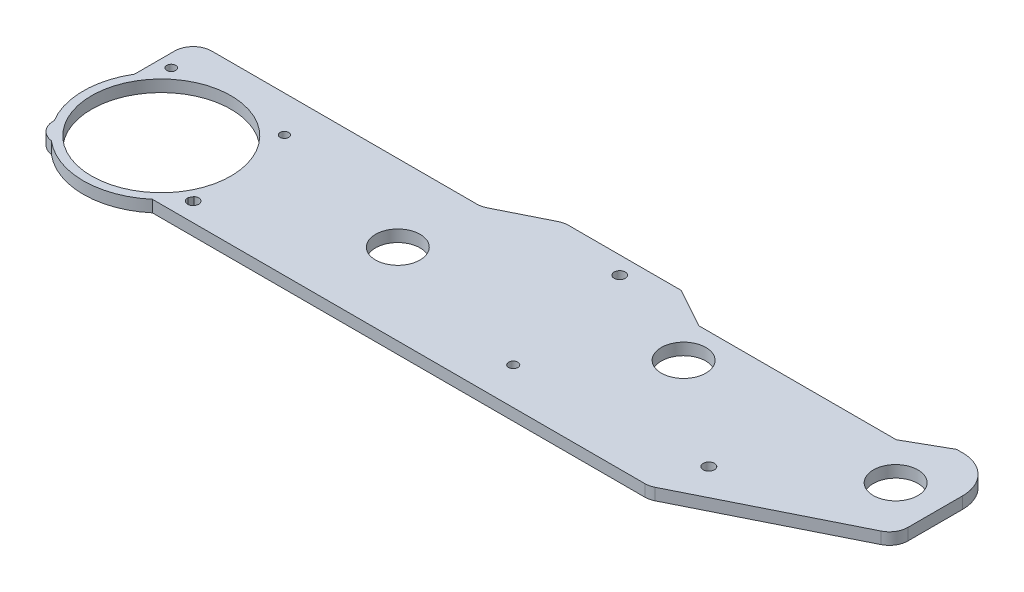
ISO-10303-21;
HEADER;
FILE_DESCRIPTION(('STEP AP214'),'2;1');
FILE_NAME('part.step','',(''),(''),'','','');
FILE_SCHEMA(('AUTOMOTIVE_DESIGN { 1 0 10303 214 1 1 1 1 }'));
ENDSEC;
DATA;
#1=APPLICATION_CONTEXT('core data for automotive mechanical design processes');
#2=APPLICATION_PROTOCOL_DEFINITION('international standard','automotive_design',2000,#1);
#3=PRODUCT_CONTEXT('',#1,'mechanical');
#4=PRODUCT('Part','Part','',(#3));
#5=PRODUCT_RELATED_PRODUCT_CATEGORY('part','',(#4));
#6=PRODUCT_DEFINITION_FORMATION('','',#4);
#7=PRODUCT_DEFINITION_CONTEXT('part definition',#1,'design');
#8=PRODUCT_DEFINITION('design','',#6,#7);
#9=PRODUCT_DEFINITION_SHAPE('','',#8);
#10=(LENGTH_UNIT() NAMED_UNIT(*) SI_UNIT(.MILLI.,.METRE.));
#11=(NAMED_UNIT(*) PLANE_ANGLE_UNIT() SI_UNIT($,.RADIAN.));
#12=(NAMED_UNIT(*) SI_UNIT($,.STERADIAN.) SOLID_ANGLE_UNIT());
#13=UNCERTAINTY_MEASURE_WITH_UNIT(LENGTH_MEASURE(1.E-05),#10,'distance_accuracy_value','');
#14=(GEOMETRIC_REPRESENTATION_CONTEXT(3) GLOBAL_UNCERTAINTY_ASSIGNED_CONTEXT((#13)) GLOBAL_UNIT_ASSIGNED_CONTEXT((#10,
#11,#12)) REPRESENTATION_CONTEXT('',''));
#15=CARTESIAN_POINT('',(0.,0.,0.));
#16=DIRECTION('',(0.,0.,1.));
#17=DIRECTION('',(1.,0.,0.));
#18=AXIS2_PLACEMENT_3D('',#15,#16,#17);
#19=CARTESIAN_POINT('',(0.,3.175,0.));
#20=DIRECTION('',(1.,0.,0.));
#21=DIRECTION('',(0.,0.,-1.));
#22=AXIS2_PLACEMENT_3D('',#19,#20,#21);
#23=PLANE('',#22);
#24=DIRECTION('',(0.,0.,1.));
#25=VECTOR('',#24,1.);
#26=CARTESIAN_POINT('',(0.,0.,0.));
#27=LINE('',#26,#25);
#28=CARTESIAN_POINT('',(0.,0.,12.4028120633884));
#29=VERTEX_POINT('',#28);
#30=CARTESIAN_POINT('',(0.,0.,23.1833461736081));
#31=VERTEX_POINT('',#30);
#32=EDGE_CURVE('E231',#29,#31,#27,.T.);
#33=ORIENTED_EDGE('',*,*,#32,.T.);
#34=DIRECTION('',(0.,1.,0.));
#35=VECTOR('',#34,1.);
#36=CARTESIAN_POINT('',(0.,0.,23.1833461736081));
#37=LINE('',#36,#35);
#38=CARTESIAN_POINT('',(0.,3.175,23.1833461736081));
#39=VERTEX_POINT('',#38);
#40=EDGE_CURVE('E438',#31,#39,#37,.T.);
#41=ORIENTED_EDGE('',*,*,#40,.T.);
#42=DIRECTION('',(0.,0.,1.));
#43=VECTOR('',#42,1.);
#44=CARTESIAN_POINT('',(0.,3.175,0.));
#45=LINE('',#44,#43);
#46=CARTESIAN_POINT('',(0.,3.175,12.4028120633884));
#47=VERTEX_POINT('',#46);
#48=EDGE_CURVE('E219',#47,#39,#45,.T.);
#49=ORIENTED_EDGE('',*,*,#48,.F.);
#50=DIRECTION('',(0.,1.,0.));
#51=VECTOR('',#50,1.);
#52=CARTESIAN_POINT('',(0.,3.175,12.4028120633884));
#53=LINE('',#52,#51);
#54=EDGE_CURVE('E274',#47,#29,#53,.F.);
#55=ORIENTED_EDGE('',*,*,#54,.T.);
#56=EDGE_LOOP('',(#33,#41,#49,#55));
#57=FACE_BOUND('',#56,.T.);
#58=ADVANCED_FACE('F35',(#57),#23,.F.);
#59=CARTESIAN_POINT('',(0.,3.175,0.));
#60=DIRECTION('',(0.,0.,1.));
#61=DIRECTION('',(1.,0.,0.));
#62=AXIS2_PLACEMENT_3D('',#59,#60,#61);
#63=PLANE('',#62);
#64=DIRECTION('',(-1.,0.,0.));
#65=VECTOR('',#64,1.);
#66=CARTESIAN_POINT('',(0.,3.175,0.));
#67=LINE('',#66,#65);
#68=CARTESIAN_POINT('',(200.,3.175,0.));
#69=VERTEX_POINT('',#68);
#70=CARTESIAN_POINT('',(198.343585303367,3.175,0.));
#71=VERTEX_POINT('',#70);
#72=EDGE_CURVE('E228',#69,#71,#67,.T.);
#73=ORIENTED_EDGE('',*,*,#72,.F.);
#74=DIRECTION('',(0.,-1.,0.));
#75=VECTOR('',#74,1.);
#76=CARTESIAN_POINT('',(200.,3.175,0.));
#77=LINE('',#76,#75);
#78=CARTESIAN_POINT('',(200.,0.,0.));
#79=VERTEX_POINT('',#78);
#80=EDGE_CURVE('E314',#69,#79,#77,.T.);
#81=ORIENTED_EDGE('',*,*,#80,.T.);
#82=DIRECTION('',(-1.,0.,0.));
#83=VECTOR('',#82,1.);
#84=CARTESIAN_POINT('',(0.,0.,0.));
#85=LINE('',#84,#83);
#86=CARTESIAN_POINT('',(198.343585303367,0.,0.));
#87=VERTEX_POINT('',#86);
#88=EDGE_CURVE('E240',#79,#87,#85,.T.);
#89=ORIENTED_EDGE('',*,*,#88,.T.);
#90=DIRECTION('',(0.,1.,0.));
#91=VECTOR('',#90,1.);
#92=CARTESIAN_POINT('',(198.343585303367,3.175,0.));
#93=LINE('',#92,#91);
#94=EDGE_CURVE('E255',#87,#71,#93,.T.);
#95=ORIENTED_EDGE('',*,*,#94,.T.);
#96=EDGE_LOOP('',(#73,#81,#89,#95));
#97=FACE_BOUND('',#96,.T.);
#98=ADVANCED_FACE('F323',(#97),#63,.F.);
#99=CARTESIAN_POINT('',(0.,3.175,0.));
#100=DIRECTION('',(0.,1.,0.));
#101=DIRECTION('',(0.,0.,1.));
#102=AXIS2_PLACEMENT_3D('',#99,#100,#101);
#103=PLANE('',#102);
#104=CARTESIAN_POINT('',(18.,3.175,34.));
#105=DIRECTION('',(0.,1.,0.));
#106=DIRECTION('',(0.,0.,1.));
#107=AXIS2_PLACEMENT_3D('',#104,#105,#106);
#108=CIRCLE('',#107,18.78);
#109=CARTESIAN_POINT('',(18.,3.175,52.78));
#110=VERTEX_POINT('',#109);
#111=EDGE_CURVE('E317',#110,#110,#108,.T.);
#112=ORIENTED_EDGE('',*,*,#111,.F.);
#113=EDGE_LOOP('',(#112));
#114=FACE_BOUND('',#113,.T.);
#115=CARTESIAN_POINT('',(37.5207499584055,3.175,44.9211981208464));
#116=DIRECTION('',(0.,1.,0.));
#117=DIRECTION('',(0.,0.,1.));
#118=AXIS2_PLACEMENT_3D('',#115,#116,#117);
#119=CIRCLE('',#118,1.5);
#120=CARTESIAN_POINT('',(36.028479152304,3.175,44.7691197158792));
#121=VERTEX_POINT('',#120);
#122=CARTESIAN_POINT('',(36.6103540196022,3.175,43.7290658988968));
#123=VERTEX_POINT('',#122);
#124=EDGE_CURVE('E375',#121,#123,#119,.T.);
#125=ORIENTED_EDGE('',*,*,#124,.F.);
#126=CARTESIAN_POINT('',(18.,3.175,34.));
#127=DIRECTION('',(0.,1.,0.));
#128=DIRECTION('',(0.,0.,1.));
#129=AXIS2_PLACEMENT_3D('',#126,#127,#128);
#130=CIRCLE('',#129,21.);
#131=EDGE_CURVE('E213',#121,#123,#130,.T.);
#132=ORIENTED_EDGE('',*,*,#131,.T.);
#133=EDGE_LOOP('',(#125,#132));
#134=FACE_BOUND('',#133,.T.);
#135=DIRECTION('',(0.,0.,-1.));
#136=VECTOR('',#135,1.);
#137=CARTESIAN_POINT('',(210.,3.175,0.));
#138=LINE('',#137,#136);
#139=CARTESIAN_POINT('',(210.,3.175,24.7625472044585));
#140=VERTEX_POINT('',#139);
#141=CARTESIAN_POINT('',(210.,3.175,10.));
#142=VERTEX_POINT('',#141);
#143=EDGE_CURVE('E218',#140,#142,#138,.T.);
#144=ORIENTED_EDGE('',*,*,#143,.T.);
#145=CARTESIAN_POINT('',(200.,3.175,10.));
#146=DIRECTION('',(0.,1.,0.));
#147=DIRECTION('',(0.,0.,1.));
#148=AXIS2_PLACEMENT_3D('',#145,#146,#147);
#149=CIRCLE('',#148,10.);
#150=EDGE_CURVE('E11',#142,#69,#149,.T.);
#151=ORIENTED_EDGE('',*,*,#150,.T.);
#152=ORIENTED_EDGE('',*,*,#72,.T.);
#153=DIRECTION('',(0.869999014001896,0.,-0.493053461234914));
#154=VECTOR('',#153,1.);
#155=CARTESIAN_POINT('',(187.967697751047,3.175,5.8803138724528));
#156=LINE('',#155,#154);
#157=CARTESIAN_POINT('',(187.967697751047,3.175,5.8803138724528));
#158=VERTEX_POINT('',#157);
#159=EDGE_CURVE('E458',#158,#71,#156,.T.);
#160=ORIENTED_EDGE('',*,*,#159,.F.);
#161=DIRECTION('',(1.,0.,0.));
#162=VECTOR('',#161,1.);
#163=CARTESIAN_POINT('',(134.77031329487,3.175,5.8803138724528));
#164=LINE('',#163,#162);
#165=CARTESIAN_POINT('',(134.77031329487,3.175,5.8803138724528));
#166=VERTEX_POINT('',#165);
#167=EDGE_CURVE('E455',#166,#158,#164,.T.);
#168=ORIENTED_EDGE('',*,*,#167,.F.);
#169=DIRECTION('',(0.875621402801549,0.,0.482998094153432));
#170=VECTOR('',#169,1.);
#171=CARTESIAN_POINT('',(124.109963400663,3.175,0.));
#172=LINE('',#171,#170);
#173=CARTESIAN_POINT('',(124.109963400663,3.175,0.));
#174=VERTEX_POINT('',#173);
#175=EDGE_CURVE('E440',#174,#166,#172,.T.);
#176=ORIENTED_EDGE('',*,*,#175,.F.);
#177=CARTESIAN_POINT('',(93.707824868426,3.175,0.));
#178=VERTEX_POINT('',#177);
#179=EDGE_CURVE('E221',#174,#178,#67,.T.);
#180=ORIENTED_EDGE('',*,*,#179,.T.);
#181=CARTESIAN_POINT('',(93.707824868426,3.175,5.));
#182=DIRECTION('',(0.,1.,0.));
#183=DIRECTION('',(0.,0.,1.));
#184=AXIS2_PLACEMENT_3D('',#181,#182,#183);
#185=CIRCLE('',#184,5.);
#186=CARTESIAN_POINT('',(91.4804528275483,3.175,0.523526634557482));
#187=VERTEX_POINT('',#186);
#188=EDGE_CURVE('E283',#178,#187,#185,.T.);
#189=ORIENTED_EDGE('',*,*,#188,.T.);
#190=DIRECTION('',(0.895294673088504,0.,-0.445474408175541));
#191=VECTOR('',#190,1.);
#192=CARTESIAN_POINT('',(92.5326133973527,3.175,0.));
#193=LINE('',#192,#191);
#194=CARTESIAN_POINT('',(78.7069311896764,3.175,6.87928542883095));
#195=VERTEX_POINT('',#194);
#196=EDGE_CURVE('E446',#195,#187,#193,.T.);
#197=ORIENTED_EDGE('',*,*,#196,.F.);
#198=CARTESIAN_POINT('',(76.4795591487987,3.175,2.40281206338843));
#199=DIRECTION('',(0.,1.,0.));
#200=DIRECTION('',(0.,0.,1.));
#201=AXIS2_PLACEMENT_3D('',#198,#199,#200);
#202=CIRCLE('',#201,5.);
#203=CARTESIAN_POINT('',(76.4795591487987,3.175,7.40281206338843));
#204=VERTEX_POINT('',#203);
#205=EDGE_CURVE('E308',#195,#204,#202,.F.);
#206=ORIENTED_EDGE('',*,*,#205,.T.);
#207=DIRECTION('',(1.,0.,0.));
#208=VECTOR('',#207,1.);
#209=CARTESIAN_POINT('',(77.654770619872,3.175,7.40281206338843));
#210=LINE('',#209,#208);
#211=CARTESIAN_POINT('',(5.,3.175,7.40281206338842));
#212=VERTEX_POINT('',#211);
#213=EDGE_CURVE('E447',#212,#204,#210,.T.);
#214=ORIENTED_EDGE('',*,*,#213,.F.);
#215=CARTESIAN_POINT('',(5.,3.175,12.4028120633884));
#216=DIRECTION('',(0.,1.,0.));
#217=DIRECTION('',(0.,0.,1.));
#218=AXIS2_PLACEMENT_3D('',#215,#216,#217);
#219=CIRCLE('',#218,5.);
#220=EDGE_CURVE('E285',#212,#47,#219,.T.);
#221=ORIENTED_EDGE('',*,*,#220,.T.);
#222=ORIENTED_EDGE('',*,*,#48,.T.);
#223=CARTESIAN_POINT('',(0.,3.175,44.816653826392));
#224=VERTEX_POINT('',#223);
#225=EDGE_CURVE('E210',#39,#224,#130,.T.);
#226=ORIENTED_EDGE('',*,*,#225,.T.);
#227=CARTESIAN_POINT('',(0.,3.175,45.));
#228=VERTEX_POINT('',#227);
#229=EDGE_CURVE('E224',#224,#228,#45,.T.);
#230=ORIENTED_EDGE('',*,*,#229,.T.);
#231=CARTESIAN_POINT('',(5.00000000000001,3.175,45.));
#232=DIRECTION('',(0.,1.,0.));
#233=DIRECTION('',(0.,0.,1.));
#234=AXIS2_PLACEMENT_3D('',#231,#232,#233);
#235=CIRCLE('',#234,5.);
#236=CARTESIAN_POINT('',(4.34855225390096,3.175,49.9573799364284));
#237=VERTEX_POINT('',#236);
#238=EDGE_CURVE('E209',#228,#237,#235,.T.);
#239=ORIENTED_EDGE('',*,*,#238,.T.);
#240=CARTESIAN_POINT('',(31.6014705087354,3.175,50.));
#241=VERTEX_POINT('',#240);
#242=EDGE_CURVE('E192',#237,#241,#130,.T.);
#243=ORIENTED_EDGE('',*,*,#242,.T.);
#244=DIRECTION('',(1.,0.,0.));
#245=VECTOR('',#244,1.);
#246=CARTESIAN_POINT('',(0.,3.175,50.));
#247=LINE('',#246,#245);
#248=CARTESIAN_POINT('',(164.327666523127,3.175,50.));
#249=VERTEX_POINT('',#248);
#250=EDGE_CURVE('E206',#241,#249,#247,.T.);
#251=ORIENTED_EDGE('',*,*,#250,.T.);
#252=CARTESIAN_POINT('',(164.327666523127,3.175,45.));
#253=DIRECTION('',(0.,1.,0.));
#254=DIRECTION('',(0.,0.,1.));
#255=AXIS2_PLACEMENT_3D('',#252,#253,#254);
#256=CIRCLE('',#255,5.);
#257=CARTESIAN_POINT('',(166.555038564004,3.175,49.4764733654425));
#258=VERTEX_POINT('',#257);
#259=EDGE_CURVE('E279',#249,#258,#256,.T.);
#260=ORIENTED_EDGE('',*,*,#259,.T.);
#261=DIRECTION('',(-0.895294673088504,0.,0.445474408175541));
#262=VECTOR('',#261,1.);
#263=CARTESIAN_POINT('',(210.,3.175,27.8594359076578));
#264=LINE('',#263,#262);
#265=CARTESIAN_POINT('',(207.227372040878,3.175,29.2390205699011));
#266=VERTEX_POINT('',#265);
#267=EDGE_CURVE('E340',#266,#258,#264,.T.);
#268=ORIENTED_EDGE('',*,*,#267,.F.);
#269=CARTESIAN_POINT('',(205.,3.175,24.7625472044585));
#270=DIRECTION('',(0.,1.,0.));
#271=DIRECTION('',(0.,0.,1.));
#272=AXIS2_PLACEMENT_3D('',#269,#270,#271);
#273=CIRCLE('',#272,5.);
#274=EDGE_CURVE('E281',#266,#140,#273,.T.);
#275=ORIENTED_EDGE('',*,*,#274,.T.);
#276=EDGE_LOOP('',(#144,#151,#152,#160,#168,#176,#180,#189,#197,#206,#214,#221,#222,#226,#230,
#239,#243,#251,#260,#268,#275));
#277=FACE_BOUND('',#276,.T.);
#278=CARTESIAN_POINT('',(140.771956051245,3.175,16.));
#279=DIRECTION('',(0.,1.,0.));
#280=DIRECTION('',(0.,0.,1.));
#281=AXIS2_PLACEMENT_3D('',#278,#279,#280);
#282=CIRCLE('',#281,6.00000000000002);
#283=CARTESIAN_POINT('',(140.771956051245,3.175,22.));
#284=VERTEX_POINT('',#283);
#285=EDGE_CURVE('E349',#284,#284,#282,.T.);
#286=ORIENTED_EDGE('',*,*,#285,.F.);
#287=EDGE_LOOP('',(#286));
#288=FACE_BOUND('',#287,.T.);
#289=CARTESIAN_POINT('',(197.921956051245,3.175,16.));
#290=DIRECTION('',(0.,1.,0.));
#291=DIRECTION('',(0.,0.,1.));
#292=AXIS2_PLACEMENT_3D('',#289,#290,#291);
#293=CIRCLE('',#292,6.00000000000002);
#294=CARTESIAN_POINT('',(197.921956051245,3.175,22.));
#295=VERTEX_POINT('',#294);
#296=EDGE_CURVE('E350',#295,#295,#293,.T.);
#297=ORIENTED_EDGE('',*,*,#296,.F.);
#298=EDGE_LOOP('',(#297));
#299=FACE_BOUND('',#298,.T.);
#300=CARTESIAN_POINT('',(75.8499135695119,3.175,28.1));
#301=DIRECTION('',(0.,1.,0.));
#302=DIRECTION('',(0.,0.,1.));
#303=AXIS2_PLACEMENT_3D('',#300,#301,#302);
#304=CIRCLE('',#303,6.);
#305=CARTESIAN_POINT('',(75.8499135695119,3.175,34.1));
#306=VERTEX_POINT('',#305);
#307=EDGE_CURVE('E246',#306,#306,#304,.T.);
#308=ORIENTED_EDGE('',*,*,#307,.F.);
#309=EDGE_LOOP('',(#308));
#310=FACE_BOUND('',#309,.T.);
#311=CARTESIAN_POINT('',(112.302052498536,3.175,4.73926011491407));
#312=DIRECTION('',(0.,1.,0.));
#313=DIRECTION('',(0.,0.,1.));
#314=AXIS2_PLACEMENT_3D('',#311,#312,#313);
#315=CIRCLE('',#314,1.50000000000013);
#316=CARTESIAN_POINT('',(112.302052498536,3.175,6.2392601149142));
#317=VERTEX_POINT('',#316);
#318=EDGE_CURVE('E363',#317,#317,#315,.T.);
#319=ORIENTED_EDGE('',*,*,#318,.F.);
#320=EDGE_LOOP('',(#319));
#321=FACE_BOUND('',#320,.T.);
#322=CARTESIAN_POINT('',(3.48952623297482,3.175,16.7876611117285));
#323=DIRECTION('',(0.,1.,0.));
#324=DIRECTION('',(0.,0.,1.));
#325=AXIS2_PLACEMENT_3D('',#322,#323,#324);
#326=CIRCLE('',#325,1.21166501811253);
#327=CARTESIAN_POINT('',(3.48952623297482,3.175,17.999326129841));
#328=VERTEX_POINT('',#327);
#329=EDGE_CURVE('E386',#328,#328,#326,.T.);
#330=ORIENTED_EDGE('',*,*,#329,.F.);
#331=EDGE_LOOP('',(#330));
#332=FACE_BOUND('',#331,.T.);
#333=CARTESIAN_POINT('',(34.3725877204713,3.175,17.1940052448511));
#334=DIRECTION('',(0.,1.,0.));
#335=DIRECTION('',(0.,0.,1.));
#336=AXIS2_PLACEMENT_3D('',#333,#334,#335);
#337=CIRCLE('',#336,1.16561711842174);
#338=CARTESIAN_POINT('',(34.3725877204713,3.175,18.3596223632728));
#339=VERTEX_POINT('',#338);
#340=EDGE_CURVE('E380',#339,#339,#337,.T.);
#341=ORIENTED_EDGE('',*,*,#340,.F.);
#342=EDGE_LOOP('',(#341));
#343=FACE_BOUND('',#342,.T.);
#344=CARTESIAN_POINT('',(118.879039361021,3.175,40.0176850426405));
#345=DIRECTION('',(0.,1.,0.));
#346=DIRECTION('',(0.,0.,1.));
#347=AXIS2_PLACEMENT_3D('',#344,#345,#346);
#348=CIRCLE('',#347,1.25);
#349=CARTESIAN_POINT('',(118.879039361021,3.175,41.2676850426405));
#350=VERTEX_POINT('',#349);
#351=EDGE_CURVE('E369',#350,#350,#348,.T.);
#352=ORIENTED_EDGE('',*,*,#351,.F.);
#353=EDGE_LOOP('',(#352));
#354=FACE_BOUND('',#353,.T.);
#355=CARTESIAN_POINT('',(168.975233936324,3.175,37.4032096333009));
#356=DIRECTION('',(0.,1.,0.));
#357=DIRECTION('',(0.,0.,1.));
#358=AXIS2_PLACEMENT_3D('',#355,#356,#357);
#359=CIRCLE('',#358,1.51727390455077);
#360=CARTESIAN_POINT('',(168.975233936324,3.175,38.9204835378516));
#361=VERTEX_POINT('',#360);
#362=EDGE_CURVE('E357',#361,#361,#359,.T.);
#363=ORIENTED_EDGE('',*,*,#362,.F.);
#364=EDGE_LOOP('',(#363));
#365=FACE_BOUND('',#364,.T.);
#366=ADVANCED_FACE('F204',(#114,#134,#277,#288,#299,#310,#321,#332,#343,#354,#365),#103,.T.);
#367=CARTESIAN_POINT('',(0.,0.,0.));
#368=DIRECTION('',(0.,1.,0.));
#369=DIRECTION('',(0.,0.,1.));
#370=AXIS2_PLACEMENT_3D('',#367,#368,#369);
#371=PLANE('',#370);
#372=CARTESIAN_POINT('',(18.,0.,34.));
#373=DIRECTION('',(0.,1.,0.));
#374=DIRECTION('',(0.,0.,1.));
#375=AXIS2_PLACEMENT_3D('',#372,#373,#374);
#376=CIRCLE('',#375,18.78);
#377=CARTESIAN_POINT('',(18.,0.,52.78));
#378=VERTEX_POINT('',#377);
#379=EDGE_CURVE('E211',#378,#378,#376,.T.);
#380=ORIENTED_EDGE('',*,*,#379,.T.);
#381=EDGE_LOOP('',(#380));
#382=FACE_BOUND('',#381,.T.);
#383=CARTESIAN_POINT('',(18.,0.,34.));
#384=DIRECTION('',(0.,1.,0.));
#385=DIRECTION('',(0.,0.,1.));
#386=AXIS2_PLACEMENT_3D('',#383,#384,#385);
#387=CIRCLE('',#386,21.);
#388=CARTESIAN_POINT('',(36.028479152304,0.,44.7691197158792));
#389=VERTEX_POINT('',#388);
#390=CARTESIAN_POINT('',(36.6103540196022,0.,43.7290658988968));
#391=VERTEX_POINT('',#390);
#392=EDGE_CURVE('E523',#389,#391,#387,.T.);
#393=ORIENTED_EDGE('',*,*,#392,.F.);
#394=CARTESIAN_POINT('',(37.5207499584055,0.,44.9211981208464));
#395=DIRECTION('',(0.,1.,0.));
#396=DIRECTION('',(0.,0.,1.));
#397=AXIS2_PLACEMENT_3D('',#394,#395,#396);
#398=CIRCLE('',#397,1.5);
#399=EDGE_CURVE('E372',#389,#391,#398,.T.);
#400=ORIENTED_EDGE('',*,*,#399,.T.);
#401=EDGE_LOOP('',(#393,#400));
#402=FACE_BOUND('',#401,.T.);
#403=ORIENTED_EDGE('',*,*,#88,.F.);
#404=CARTESIAN_POINT('',(200.,0.,10.));
#405=DIRECTION('',(0.,1.,0.));
#406=DIRECTION('',(0.,0.,1.));
#407=AXIS2_PLACEMENT_3D('',#404,#405,#406);
#408=CIRCLE('',#407,10.);
#409=CARTESIAN_POINT('',(210.,0.,10.));
#410=VERTEX_POINT('',#409);
#411=EDGE_CURVE('E57',#79,#410,#408,.F.);
#412=ORIENTED_EDGE('',*,*,#411,.T.);
#413=DIRECTION('',(0.,0.,-1.));
#414=VECTOR('',#413,1.);
#415=CARTESIAN_POINT('',(210.,0.,0.));
#416=LINE('',#415,#414);
#417=CARTESIAN_POINT('',(210.,0.,24.7625472044585));
#418=VERTEX_POINT('',#417);
#419=EDGE_CURVE('E237',#418,#410,#416,.T.);
#420=ORIENTED_EDGE('',*,*,#419,.F.);
#421=CARTESIAN_POINT('',(205.,0.,24.7625472044585));
#422=DIRECTION('',(0.,1.,0.));
#423=DIRECTION('',(0.,0.,1.));
#424=AXIS2_PLACEMENT_3D('',#421,#422,#423);
#425=CIRCLE('',#424,5.);
#426=CARTESIAN_POINT('',(207.227372040878,0.,29.2390205699011));
#427=VERTEX_POINT('',#426);
#428=EDGE_CURVE('E265',#418,#427,#425,.F.);
#429=ORIENTED_EDGE('',*,*,#428,.T.);
#430=DIRECTION('',(-0.895294673088504,0.,0.445474408175541));
#431=VECTOR('',#430,1.);
#432=CARTESIAN_POINT('',(52.7851670626083,0.,106.085283513341));
#433=LINE('',#432,#431);
#434=CARTESIAN_POINT('',(166.555038564004,0.,49.4764733654425));
#435=VERTEX_POINT('',#434);
#436=EDGE_CURVE('E338',#427,#435,#433,.T.);
#437=ORIENTED_EDGE('',*,*,#436,.T.);
#438=CARTESIAN_POINT('',(164.327666523127,0.,45.));
#439=DIRECTION('',(0.,1.,0.));
#440=DIRECTION('',(0.,0.,1.));
#441=AXIS2_PLACEMENT_3D('',#438,#439,#440);
#442=CIRCLE('',#441,5.);
#443=CARTESIAN_POINT('',(164.327666523127,0.,50.));
#444=VERTEX_POINT('',#443);
#445=EDGE_CURVE('E262',#435,#444,#442,.F.);
#446=ORIENTED_EDGE('',*,*,#445,.T.);
#447=DIRECTION('',(1.,0.,0.));
#448=VECTOR('',#447,1.);
#449=CARTESIAN_POINT('',(0.,0.,50.));
#450=LINE('',#449,#448);
#451=CARTESIAN_POINT('',(31.6014705087354,0.,50.));
#452=VERTEX_POINT('',#451);
#453=EDGE_CURVE('E234',#452,#444,#450,.T.);
#454=ORIENTED_EDGE('',*,*,#453,.F.);
#455=CARTESIAN_POINT('',(4.34855225390096,0.,49.9573799364284));
#456=VERTEX_POINT('',#455);
#457=EDGE_CURVE('E195',#456,#452,#387,.T.);
#458=ORIENTED_EDGE('',*,*,#457,.F.);
#459=CARTESIAN_POINT('',(5.00000000000001,0.,45.));
#460=DIRECTION('',(0.,1.,0.));
#461=DIRECTION('',(0.,0.,1.));
#462=AXIS2_PLACEMENT_3D('',#459,#460,#461);
#463=CIRCLE('',#462,5.);
#464=CARTESIAN_POINT('',(0.,0.,45.));
#465=VERTEX_POINT('',#464);
#466=EDGE_CURVE('E271',#456,#465,#463,.F.);
#467=ORIENTED_EDGE('',*,*,#466,.T.);
#468=CARTESIAN_POINT('',(0.,0.,44.816653826392));
#469=VERTEX_POINT('',#468);
#470=EDGE_CURVE('E235',#469,#465,#27,.T.);
#471=ORIENTED_EDGE('',*,*,#470,.F.);
#472=EDGE_CURVE('E437',#31,#469,#387,.T.);
#473=ORIENTED_EDGE('',*,*,#472,.F.);
#474=ORIENTED_EDGE('',*,*,#32,.F.);
#475=CARTESIAN_POINT('',(5.,0.,12.4028120633884));
#476=DIRECTION('',(0.,1.,0.));
#477=DIRECTION('',(0.,0.,1.));
#478=AXIS2_PLACEMENT_3D('',#475,#476,#477);
#479=CIRCLE('',#478,5.);
#480=CARTESIAN_POINT('',(5.00000000000001,0.,7.40281206338842));
#481=VERTEX_POINT('',#480);
#482=EDGE_CURVE('E269',#29,#481,#479,.F.);
#483=ORIENTED_EDGE('',*,*,#482,.T.);
#484=DIRECTION('',(1.,0.,0.));
#485=VECTOR('',#484,1.);
#486=CARTESIAN_POINT('',(0.,0.,7.40281206338842));
#487=LINE('',#486,#485);
#488=CARTESIAN_POINT('',(76.4795591487987,0.,7.40281206338843));
#489=VERTEX_POINT('',#488);
#490=EDGE_CURVE('E346',#481,#489,#487,.T.);
#491=ORIENTED_EDGE('',*,*,#490,.T.);
#492=CARTESIAN_POINT('',(76.4795591487987,0.,2.40281206338843));
#493=DIRECTION('',(0.,1.,0.));
#494=DIRECTION('',(0.,0.,1.));
#495=AXIS2_PLACEMENT_3D('',#492,#493,#494);
#496=CIRCLE('',#495,5.);
#497=CARTESIAN_POINT('',(78.7069311896765,0.,6.87928542883095));
#498=VERTEX_POINT('',#497);
#499=EDGE_CURVE('E310',#489,#498,#496,.T.);
#500=ORIENTED_EDGE('',*,*,#499,.T.);
#501=DIRECTION('',(0.895294673088504,0.,-0.445474408175541));
#502=VECTOR('',#501,1.);
#503=CARTESIAN_POINT('',(18.3628610168761,0.,36.9048622083704));
#504=LINE('',#503,#502);
#505=CARTESIAN_POINT('',(91.4804528275483,0.,0.523526634557472));
#506=VERTEX_POINT('',#505);
#507=EDGE_CURVE('E334',#498,#506,#504,.T.);
#508=ORIENTED_EDGE('',*,*,#507,.T.);
#509=CARTESIAN_POINT('',(93.707824868426,0.,5.));
#510=DIRECTION('',(0.,1.,0.));
#511=DIRECTION('',(0.,0.,1.));
#512=AXIS2_PLACEMENT_3D('',#509,#510,#511);
#513=CIRCLE('',#512,5.);
#514=CARTESIAN_POINT('',(93.707824868426,0.,0.));
#515=VERTEX_POINT('',#514);
#516=EDGE_CURVE('E267',#506,#515,#513,.F.);
#517=ORIENTED_EDGE('',*,*,#516,.T.);
#518=CARTESIAN_POINT('',(124.109963400663,0.,0.));
#519=VERTEX_POINT('',#518);
#520=EDGE_CURVE('E239',#519,#515,#85,.T.);
#521=ORIENTED_EDGE('',*,*,#520,.F.);
#522=DIRECTION('',(0.875621402801549,0.,0.482998094153432));
#523=VECTOR('',#522,1.);
#524=CARTESIAN_POINT('',(28.9532607598549,0.,-52.489016228229));
#525=LINE('',#524,#523);
#526=CARTESIAN_POINT('',(134.77031329487,0.,5.8803138724528));
#527=VERTEX_POINT('',#526);
#528=EDGE_CURVE('E335',#519,#527,#525,.T.);
#529=ORIENTED_EDGE('',*,*,#528,.T.);
#530=DIRECTION('',(1.,0.,0.));
#531=VECTOR('',#530,1.);
#532=CARTESIAN_POINT('',(0.,0.,5.8803138724528));
#533=LINE('',#532,#531);
#534=CARTESIAN_POINT('',(187.967697751047,0.,5.8803138724528));
#535=VERTEX_POINT('',#534);
#536=EDGE_CURVE('E258',#527,#535,#533,.T.);
#537=ORIENTED_EDGE('',*,*,#536,.T.);
#538=DIRECTION('',(0.869999014001896,0.,-0.493053461234914));
#539=VECTOR('',#538,1.);
#540=CARTESIAN_POINT('',(48.2176658725901,0.,85.0806759606939));
#541=LINE('',#540,#539);
#542=EDGE_CURVE('E330',#535,#87,#541,.T.);
#543=ORIENTED_EDGE('',*,*,#542,.T.);
#544=EDGE_LOOP('',(#403,#412,#420,#429,#437,#446,#454,#458,#467,#471,#473,#474,#483,#491,#500,
#508,#517,#521,#529,#537,#543));
#545=FACE_BOUND('',#544,.T.);
#546=CARTESIAN_POINT('',(168.975233936324,0.,37.4032096333009));
#547=DIRECTION('',(0.,1.,0.));
#548=DIRECTION('',(0.,0.,1.));
#549=AXIS2_PLACEMENT_3D('',#546,#547,#548);
#550=CIRCLE('',#549,1.51727390455077);
#551=CARTESIAN_POINT('',(168.975233936324,0.,38.9204835378516));
#552=VERTEX_POINT('',#551);
#553=EDGE_CURVE('E252',#552,#552,#550,.T.);
#554=ORIENTED_EDGE('',*,*,#553,.T.);
#555=EDGE_LOOP('',(#554));
#556=FACE_BOUND('',#555,.T.);
#557=CARTESIAN_POINT('',(112.302052498536,0.,4.73926011491407));
#558=DIRECTION('',(0.,1.,0.));
#559=DIRECTION('',(0.,0.,1.));
#560=AXIS2_PLACEMENT_3D('',#557,#558,#559);
#561=CIRCLE('',#560,1.50000000000013);
#562=CARTESIAN_POINT('',(112.302052498536,0.,6.2392601149142));
#563=VERTEX_POINT('',#562);
#564=EDGE_CURVE('E360',#563,#563,#561,.T.);
#565=ORIENTED_EDGE('',*,*,#564,.T.);
#566=EDGE_LOOP('',(#565));
#567=FACE_BOUND('',#566,.T.);
#568=CARTESIAN_POINT('',(118.879039361021,0.,40.0176850426405));
#569=DIRECTION('',(0.,1.,0.));
#570=DIRECTION('',(0.,0.,1.));
#571=AXIS2_PLACEMENT_3D('',#568,#569,#570);
#572=CIRCLE('',#571,1.25);
#573=CARTESIAN_POINT('',(118.879039361021,0.,41.2676850426405));
#574=VERTEX_POINT('',#573);
#575=EDGE_CURVE('E366',#574,#574,#572,.T.);
#576=ORIENTED_EDGE('',*,*,#575,.T.);
#577=EDGE_LOOP('',(#576));
#578=FACE_BOUND('',#577,.T.);
#579=CARTESIAN_POINT('',(34.3725877204713,0.,17.1940052448511));
#580=DIRECTION('',(0.,1.,0.));
#581=DIRECTION('',(0.,0.,1.));
#582=AXIS2_PLACEMENT_3D('',#579,#580,#581);
#583=CIRCLE('',#582,1.16561711842174);
#584=CARTESIAN_POINT('',(34.3725877204713,0.,18.3596223632728));
#585=VERTEX_POINT('',#584);
#586=EDGE_CURVE('E377',#585,#585,#583,.T.);
#587=ORIENTED_EDGE('',*,*,#586,.T.);
#588=EDGE_LOOP('',(#587));
#589=FACE_BOUND('',#588,.T.);
#590=CARTESIAN_POINT('',(3.48952623297482,0.,16.7876611117285));
#591=DIRECTION('',(0.,1.,0.));
#592=DIRECTION('',(0.,0.,1.));
#593=AXIS2_PLACEMENT_3D('',#590,#591,#592);
#594=CIRCLE('',#593,1.21166501811253);
#595=CARTESIAN_POINT('',(3.48952623297482,0.,17.999326129841));
#596=VERTEX_POINT('',#595);
#597=EDGE_CURVE('E383',#596,#596,#594,.T.);
#598=ORIENTED_EDGE('',*,*,#597,.T.);
#599=EDGE_LOOP('',(#598));
#600=FACE_BOUND('',#599,.T.);
#601=CARTESIAN_POINT('',(75.8499135695119,0.,28.1));
#602=DIRECTION('',(0.,1.,0.));
#603=DIRECTION('',(0.,0.,1.));
#604=AXIS2_PLACEMENT_3D('',#601,#602,#603);
#605=CIRCLE('',#604,6.);
#606=CARTESIAN_POINT('',(75.8499135695119,0.,34.1));
#607=VERTEX_POINT('',#606);
#608=EDGE_CURVE('E242',#607,#607,#605,.T.);
#609=ORIENTED_EDGE('',*,*,#608,.T.);
#610=EDGE_LOOP('',(#609));
#611=FACE_BOUND('',#610,.T.);
#612=CARTESIAN_POINT('',(197.921956051245,0.,16.));
#613=DIRECTION('',(0.,1.,0.));
#614=DIRECTION('',(0.,0.,1.));
#615=AXIS2_PLACEMENT_3D('',#612,#613,#614);
#616=CIRCLE('',#615,6.00000000000002);
#617=CARTESIAN_POINT('',(197.921956051245,0.,22.));
#618=VERTEX_POINT('',#617);
#619=EDGE_CURVE('E245',#618,#618,#616,.T.);
#620=ORIENTED_EDGE('',*,*,#619,.T.);
#621=EDGE_LOOP('',(#620));
#622=FACE_BOUND('',#621,.T.);
#623=CARTESIAN_POINT('',(140.771956051245,0.,16.));
#624=DIRECTION('',(0.,1.,0.));
#625=DIRECTION('',(0.,0.,1.));
#626=AXIS2_PLACEMENT_3D('',#623,#624,#625);
#627=CIRCLE('',#626,6.00000000000002);
#628=CARTESIAN_POINT('',(140.771956051245,0.,22.));
#629=VERTEX_POINT('',#628);
#630=EDGE_CURVE('E249',#629,#629,#627,.T.);
#631=ORIENTED_EDGE('',*,*,#630,.T.);
#632=EDGE_LOOP('',(#631));
#633=FACE_BOUND('',#632,.T.);
#634=ADVANCED_FACE('F328',(#382,#402,#545,#556,#567,#578,#589,#600,#611,#622,#633),#371,.F.);
#635=ORIENTED_EDGE('',*,*,#229,.F.);
#636=DIRECTION('',(0.,1.,0.));
#637=VECTOR('',#636,1.);
#638=CARTESIAN_POINT('',(0.,0.,44.816653826392));
#639=LINE('',#638,#637);
#640=EDGE_CURVE('E199',#224,#469,#639,.F.);
#641=ORIENTED_EDGE('',*,*,#640,.T.);
#642=ORIENTED_EDGE('',*,*,#470,.T.);
#643=DIRECTION('',(0.,-1.,0.));
#644=VECTOR('',#643,1.);
#645=CARTESIAN_POINT('',(0.,3.175,45.));
#646=LINE('',#645,#644);
#647=EDGE_CURVE('E276',#465,#228,#646,.F.);
#648=ORIENTED_EDGE('',*,*,#647,.T.);
#649=EDGE_LOOP('',(#635,#641,#642,#648));
#650=FACE_BOUND('',#649,.T.);
#651=ADVANCED_FACE('F413',(#650),#23,.F.);
#652=CARTESIAN_POINT('',(0.,3.175,50.));
#653=DIRECTION('',(0.,0.,-1.));
#654=DIRECTION('',(-1.,0.,0.));
#655=AXIS2_PLACEMENT_3D('',#652,#653,#654);
#656=PLANE('',#655);
#657=ORIENTED_EDGE('',*,*,#250,.F.);
#658=DIRECTION('',(0.,1.,0.));
#659=VECTOR('',#658,1.);
#660=CARTESIAN_POINT('',(31.6014705087354,0.,50.));
#661=LINE('',#660,#659);
#662=EDGE_CURVE('E189',#241,#452,#661,.F.);
#663=ORIENTED_EDGE('',*,*,#662,.T.);
#664=ORIENTED_EDGE('',*,*,#453,.T.);
#665=DIRECTION('',(0.,1.,0.));
#666=VECTOR('',#665,1.);
#667=CARTESIAN_POINT('',(164.327666523127,3.175,50.));
#668=LINE('',#667,#666);
#669=EDGE_CURVE('E217',#444,#249,#668,.T.);
#670=ORIENTED_EDGE('',*,*,#669,.T.);
#671=EDGE_LOOP('',(#657,#663,#664,#670));
#672=FACE_BOUND('',#671,.T.);
#673=ADVANCED_FACE('F215',(#672),#656,.F.);
#674=CARTESIAN_POINT('',(210.,3.175,0.));
#675=DIRECTION('',(-1.,0.,0.));
#676=DIRECTION('',(0.,0.,1.));
#677=AXIS2_PLACEMENT_3D('',#674,#675,#676);
#678=PLANE('',#677);
#679=ORIENTED_EDGE('',*,*,#419,.T.);
#680=DIRECTION('',(0.,-1.,0.));
#681=VECTOR('',#680,1.);
#682=CARTESIAN_POINT('',(210.,3.175,10.));
#683=LINE('',#682,#681);
#684=EDGE_CURVE('E43',#410,#142,#683,.F.);
#685=ORIENTED_EDGE('',*,*,#684,.T.);
#686=ORIENTED_EDGE('',*,*,#143,.F.);
#687=DIRECTION('',(0.,-1.,0.));
#688=VECTOR('',#687,1.);
#689=CARTESIAN_POINT('',(210.,3.175,24.7625472044585));
#690=LINE('',#689,#688);
#691=EDGE_CURVE('E301',#140,#418,#690,.T.);
#692=ORIENTED_EDGE('',*,*,#691,.T.);
#693=EDGE_LOOP('',(#679,#685,#686,#692));
#694=FACE_BOUND('',#693,.T.);
#695=ADVANCED_FACE('F406',(#694),#678,.F.);
#696=ORIENTED_EDGE('',*,*,#520,.T.);
#697=DIRECTION('',(0.,1.,0.));
#698=VECTOR('',#697,1.);
#699=CARTESIAN_POINT('',(93.707824868426,3.175,0.));
#700=LINE('',#699,#698);
#701=EDGE_CURVE('E298',#515,#178,#700,.T.);
#702=ORIENTED_EDGE('',*,*,#701,.T.);
#703=ORIENTED_EDGE('',*,*,#179,.F.);
#704=DIRECTION('',(0.,-1.,0.));
#705=VECTOR('',#704,1.);
#706=CARTESIAN_POINT('',(124.109963400663,3.175,0.));
#707=LINE('',#706,#705);
#708=EDGE_CURVE('E230',#174,#519,#707,.T.);
#709=ORIENTED_EDGE('',*,*,#708,.T.);
#710=EDGE_LOOP('',(#696,#702,#703,#709));
#711=FACE_BOUND('',#710,.T.);
#712=ADVANCED_FACE('F396',(#711),#63,.F.);
#713=CARTESIAN_POINT('',(3.48952623297482,3.175,16.7876611117285));
#714=DIRECTION('',(0.,-1.,0.));
#715=DIRECTION('',(0.,0.,-1.));
#716=AXIS2_PLACEMENT_3D('',#713,#714,#715);
#717=CYLINDRICAL_SURFACE('',#716,1.21166501811253);
#718=ORIENTED_EDGE('',*,*,#329,.T.);
#719=EDGE_LOOP('',(#718));
#720=FACE_BOUND('',#719,.T.);
#721=ORIENTED_EDGE('',*,*,#597,.F.);
#722=EDGE_LOOP('',(#721));
#723=FACE_BOUND('',#722,.T.);
#724=ADVANCED_FACE('F393',(#720,#723),#717,.F.);
#725=CARTESIAN_POINT('',(34.3725877204713,3.175,17.1940052448511));
#726=DIRECTION('',(0.,-1.,0.));
#727=DIRECTION('',(0.,0.,-1.));
#728=AXIS2_PLACEMENT_3D('',#725,#726,#727);
#729=CYLINDRICAL_SURFACE('',#728,1.16561711842174);
#730=ORIENTED_EDGE('',*,*,#340,.T.);
#731=EDGE_LOOP('',(#730));
#732=FACE_BOUND('',#731,.T.);
#733=ORIENTED_EDGE('',*,*,#586,.F.);
#734=EDGE_LOOP('',(#733));
#735=FACE_BOUND('',#734,.T.);
#736=ADVANCED_FACE('F395',(#732,#735),#729,.F.);
#737=CARTESIAN_POINT('',(37.5207499584055,3.175,44.9211981208464));
#738=DIRECTION('',(0.,-1.,0.));
#739=DIRECTION('',(0.,0.,-1.));
#740=AXIS2_PLACEMENT_3D('',#737,#738,#739);
#741=CYLINDRICAL_SURFACE('',#740,1.5);
#742=DIRECTION('',(0.,1.,0.));
#743=VECTOR('',#742,1.);
#744=CARTESIAN_POINT('',(36.6103540196022,1.5875,43.7290658988968));
#745=LINE('',#744,#743);
#746=EDGE_CURVE('E200',#391,#123,#745,.T.);
#747=ORIENTED_EDGE('',*,*,#746,.F.);
#748=ORIENTED_EDGE('',*,*,#399,.F.);
#749=DIRECTION('',(0.,1.,0.));
#750=VECTOR('',#749,1.);
#751=CARTESIAN_POINT('',(36.028479152304,1.5875,44.7691197158793));
#752=LINE('',#751,#750);
#753=EDGE_CURVE('E520',#121,#389,#752,.F.);
#754=ORIENTED_EDGE('',*,*,#753,.F.);
#755=ORIENTED_EDGE('',*,*,#124,.T.);
#756=EDGE_LOOP('',(#747,#748,#754,#755));
#757=FACE_BOUND('',#756,.T.);
#758=ADVANCED_FACE('F403',(#757),#741,.F.);
#759=CARTESIAN_POINT('',(118.879039361021,3.175,40.0176850426405));
#760=DIRECTION('',(0.,-1.,0.));
#761=DIRECTION('',(0.,0.,-1.));
#762=AXIS2_PLACEMENT_3D('',#759,#760,#761);
#763=CYLINDRICAL_SURFACE('',#762,1.25);
#764=ORIENTED_EDGE('',*,*,#351,.T.);
#765=EDGE_LOOP('',(#764));
#766=FACE_BOUND('',#765,.T.);
#767=ORIENTED_EDGE('',*,*,#575,.F.);
#768=EDGE_LOOP('',(#767));
#769=FACE_BOUND('',#768,.T.);
#770=ADVANCED_FACE('F504',(#766,#769),#763,.F.);
#771=CARTESIAN_POINT('',(112.302052498536,3.175,4.73926011491407));
#772=DIRECTION('',(0.,-1.,0.));
#773=DIRECTION('',(0.,0.,-1.));
#774=AXIS2_PLACEMENT_3D('',#771,#772,#773);
#775=CYLINDRICAL_SURFACE('',#774,1.50000000000013);
#776=ORIENTED_EDGE('',*,*,#318,.T.);
#777=EDGE_LOOP('',(#776));
#778=FACE_BOUND('',#777,.T.);
#779=ORIENTED_EDGE('',*,*,#564,.F.);
#780=EDGE_LOOP('',(#779));
#781=FACE_BOUND('',#780,.T.);
#782=ADVANCED_FACE('F500',(#778,#781),#775,.F.);
#783=CARTESIAN_POINT('',(168.975233936324,3.175,37.4032096333009));
#784=DIRECTION('',(0.,-1.,0.));
#785=DIRECTION('',(0.,0.,-1.));
#786=AXIS2_PLACEMENT_3D('',#783,#784,#785);
#787=CYLINDRICAL_SURFACE('',#786,1.51727390455077);
#788=ORIENTED_EDGE('',*,*,#362,.T.);
#789=EDGE_LOOP('',(#788));
#790=FACE_BOUND('',#789,.T.);
#791=ORIENTED_EDGE('',*,*,#553,.F.);
#792=EDGE_LOOP('',(#791));
#793=FACE_BOUND('',#792,.T.);
#794=ADVANCED_FACE('F496',(#790,#793),#787,.F.);
#795=CARTESIAN_POINT('',(75.8499135695119,-53.975,28.1));
#796=DIRECTION('',(0.,1.,0.));
#797=DIRECTION('',(0.,0.,1.));
#798=AXIS2_PLACEMENT_3D('',#795,#796,#797);
#799=CYLINDRICAL_SURFACE('',#798,6.);
#800=ORIENTED_EDGE('',*,*,#307,.T.);
#801=EDGE_LOOP('',(#800));
#802=FACE_BOUND('',#801,.T.);
#803=ORIENTED_EDGE('',*,*,#608,.F.);
#804=EDGE_LOOP('',(#803));
#805=FACE_BOUND('',#804,.T.);
#806=ADVANCED_FACE('F489',(#802,#805),#799,.F.);
#807=CARTESIAN_POINT('',(197.921956051245,-53.975,16.));
#808=DIRECTION('',(0.,1.,0.));
#809=DIRECTION('',(0.,0.,1.));
#810=AXIS2_PLACEMENT_3D('',#807,#808,#809);
#811=CYLINDRICAL_SURFACE('',#810,6.00000000000002);
#812=ORIENTED_EDGE('',*,*,#296,.T.);
#813=EDGE_LOOP('',(#812));
#814=FACE_BOUND('',#813,.T.);
#815=ORIENTED_EDGE('',*,*,#619,.F.);
#816=EDGE_LOOP('',(#815));
#817=FACE_BOUND('',#816,.T.);
#818=ADVANCED_FACE('F486',(#814,#817),#811,.F.);
#819=CARTESIAN_POINT('',(140.771956051245,-53.975,16.));
#820=DIRECTION('',(0.,1.,0.));
#821=DIRECTION('',(0.,0.,1.));
#822=AXIS2_PLACEMENT_3D('',#819,#820,#821);
#823=CYLINDRICAL_SURFACE('',#822,6.00000000000002);
#824=ORIENTED_EDGE('',*,*,#285,.T.);
#825=EDGE_LOOP('',(#824));
#826=FACE_BOUND('',#825,.T.);
#827=ORIENTED_EDGE('',*,*,#630,.F.);
#828=EDGE_LOOP('',(#827));
#829=FACE_BOUND('',#828,.T.);
#830=ADVANCED_FACE('F481',(#826,#829),#823,.F.);
#831=CARTESIAN_POINT('',(134.77031329487,-6.825,5.8803138724528));
#832=DIRECTION('',(0.,0.,1.));
#833=DIRECTION('',(1.,0.,0.));
#834=AXIS2_PLACEMENT_3D('',#831,#832,#833);
#835=PLANE('',#834);
#836=DIRECTION('',(0.,1.,0.));
#837=VECTOR('',#836,1.);
#838=CARTESIAN_POINT('',(134.77031329487,-6.825,5.8803138724528));
#839=LINE('',#838,#837);
#840=EDGE_CURVE('E461',#527,#166,#839,.T.);
#841=ORIENTED_EDGE('',*,*,#840,.T.);
#842=ORIENTED_EDGE('',*,*,#167,.T.);
#843=DIRECTION('',(0.,1.,0.));
#844=VECTOR('',#843,1.);
#845=CARTESIAN_POINT('',(187.967697751047,-6.825,5.8803138724528));
#846=LINE('',#845,#844);
#847=EDGE_CURVE('E450',#535,#158,#846,.T.);
#848=ORIENTED_EDGE('',*,*,#847,.F.);
#849=ORIENTED_EDGE('',*,*,#536,.F.);
#850=EDGE_LOOP('',(#841,#842,#848,#849));
#851=FACE_BOUND('',#850,.T.);
#852=ADVANCED_FACE('F464',(#851),#835,.F.);
#853=CARTESIAN_POINT('',(187.967697751047,-6.825,5.8803138724528));
#854=DIRECTION('',(0.493053461234914,0.,0.869999014001896));
#855=DIRECTION('',(0.869999014001896,0.,-0.493053461234914));
#856=AXIS2_PLACEMENT_3D('',#853,#854,#855);
#857=PLANE('',#856);
#858=ORIENTED_EDGE('',*,*,#847,.T.);
#859=ORIENTED_EDGE('',*,*,#159,.T.);
#860=ORIENTED_EDGE('',*,*,#94,.F.);
#861=ORIENTED_EDGE('',*,*,#542,.F.);
#862=EDGE_LOOP('',(#858,#859,#860,#861));
#863=FACE_BOUND('',#862,.T.);
#864=ADVANCED_FACE('F472',(#863),#857,.F.);
#865=CARTESIAN_POINT('',(124.109963400663,-6.825,0.));
#866=DIRECTION('',(-0.482998094153432,0.,0.875621402801549));
#867=DIRECTION('',(0.875621402801549,0.,0.482998094153432));
#868=AXIS2_PLACEMENT_3D('',#865,#866,#867);
#869=PLANE('',#868);
#870=ORIENTED_EDGE('',*,*,#708,.F.);
#871=ORIENTED_EDGE('',*,*,#175,.T.);
#872=ORIENTED_EDGE('',*,*,#840,.F.);
#873=ORIENTED_EDGE('',*,*,#528,.F.);
#874=EDGE_LOOP('',(#870,#871,#872,#873));
#875=FACE_BOUND('',#874,.T.);
#876=ADVANCED_FACE('F469',(#875),#869,.F.);
#877=CARTESIAN_POINT('',(77.654770619872,-6.825,7.40281206338843));
#878=DIRECTION('',(0.,0.,1.));
#879=DIRECTION('',(1.,0.,0.));
#880=AXIS2_PLACEMENT_3D('',#877,#878,#879);
#881=PLANE('',#880);
#882=ORIENTED_EDGE('',*,*,#490,.F.);
#883=DIRECTION('',(0.,1.,0.));
#884=VECTOR('',#883,1.);
#885=CARTESIAN_POINT('',(5.,-6.825,7.40281206338842));
#886=LINE('',#885,#884);
#887=EDGE_CURVE('E290',#481,#212,#886,.T.);
#888=ORIENTED_EDGE('',*,*,#887,.T.);
#889=ORIENTED_EDGE('',*,*,#213,.T.);
#890=DIRECTION('',(0.,1.,0.));
#891=VECTOR('',#890,1.);
#892=CARTESIAN_POINT('',(76.4795591487987,0.,7.40281206338843));
#893=LINE('',#892,#891);
#894=EDGE_CURVE('E288',#204,#489,#893,.F.);
#895=ORIENTED_EDGE('',*,*,#894,.T.);
#896=EDGE_LOOP('',(#882,#888,#889,#895));
#897=FACE_BOUND('',#896,.T.);
#898=ADVANCED_FACE('F479',(#897),#881,.F.);
#899=CARTESIAN_POINT('',(92.5326133973527,-6.825,0.));
#900=DIRECTION('',(0.445474408175541,0.,0.895294673088504));
#901=DIRECTION('',(0.895294673088504,0.,-0.445474408175541));
#902=AXIS2_PLACEMENT_3D('',#899,#900,#901);
#903=PLANE('',#902);
#904=ORIENTED_EDGE('',*,*,#507,.F.);
#905=DIRECTION('',(0.,1.,0.));
#906=VECTOR('',#905,1.);
#907=CARTESIAN_POINT('',(78.7069311896764,3.175,6.87928542883095));
#908=LINE('',#907,#906);
#909=EDGE_CURVE('E295',#498,#195,#908,.T.);
#910=ORIENTED_EDGE('',*,*,#909,.T.);
#911=ORIENTED_EDGE('',*,*,#196,.T.);
#912=DIRECTION('',(0.,1.,0.));
#913=VECTOR('',#912,1.);
#914=CARTESIAN_POINT('',(91.4804528275483,-6.825,0.523526634557481));
#915=LINE('',#914,#913);
#916=EDGE_CURVE('E293',#187,#506,#915,.F.);
#917=ORIENTED_EDGE('',*,*,#916,.T.);
#918=EDGE_LOOP('',(#904,#910,#911,#917));
#919=FACE_BOUND('',#918,.T.);
#920=ADVANCED_FACE('F563',(#919),#903,.F.);
#921=CARTESIAN_POINT('',(210.,-6.825,27.8594359076578));
#922=DIRECTION('',(-0.445474408175541,0.,-0.895294673088504));
#923=DIRECTION('',(-0.895294673088504,0.,0.445474408175541));
#924=AXIS2_PLACEMENT_3D('',#921,#922,#923);
#925=PLANE('',#924);
#926=ORIENTED_EDGE('',*,*,#436,.F.);
#927=DIRECTION('',(0.,-1.,0.));
#928=VECTOR('',#927,1.);
#929=CARTESIAN_POINT('',(207.227372040878,-6.825,29.2390205699011));
#930=LINE('',#929,#928);
#931=EDGE_CURVE('E306',#427,#266,#930,.F.);
#932=ORIENTED_EDGE('',*,*,#931,.T.);
#933=ORIENTED_EDGE('',*,*,#267,.T.);
#934=DIRECTION('',(0.,1.,0.));
#935=VECTOR('',#934,1.);
#936=CARTESIAN_POINT('',(166.555038564004,-6.825,49.4764733654425));
#937=LINE('',#936,#935);
#938=EDGE_CURVE('E304',#258,#435,#937,.F.);
#939=ORIENTED_EDGE('',*,*,#938,.T.);
#940=EDGE_LOOP('',(#926,#932,#933,#939));
#941=FACE_BOUND('',#940,.T.);
#942=ADVANCED_FACE('F547',(#941),#925,.F.);
#943=CARTESIAN_POINT('',(5.00000000000001,3.175,45.));
#944=DIRECTION('',(0.,-1.,0.));
#945=DIRECTION('',(0.,0.,-1.));
#946=AXIS2_PLACEMENT_3D('',#943,#944,#945);
#947=CYLINDRICAL_SURFACE('',#946,5.);
#948=DIRECTION('',(0.,1.,0.));
#949=VECTOR('',#948,1.);
#950=CARTESIAN_POINT('',(4.34855225390096,1.5875,49.9573799364284));
#951=LINE('',#950,#949);
#952=EDGE_CURVE('E312',#237,#456,#951,.F.);
#953=ORIENTED_EDGE('',*,*,#952,.F.);
#954=ORIENTED_EDGE('',*,*,#238,.F.);
#955=ORIENTED_EDGE('',*,*,#647,.F.);
#956=ORIENTED_EDGE('',*,*,#466,.F.);
#957=EDGE_LOOP('',(#953,#954,#955,#956));
#958=FACE_BOUND('',#957,.T.);
#959=ADVANCED_FACE('F553',(#958),#947,.T.);
#960=CARTESIAN_POINT('',(5.,-6.825,12.4028120633884));
#961=DIRECTION('',(0.,1.,0.));
#962=DIRECTION('',(0.,0.,1.));
#963=AXIS2_PLACEMENT_3D('',#960,#961,#962);
#964=CYLINDRICAL_SURFACE('',#963,5.);
#965=ORIENTED_EDGE('',*,*,#482,.F.);
#966=ORIENTED_EDGE('',*,*,#54,.F.);
#967=ORIENTED_EDGE('',*,*,#220,.F.);
#968=ORIENTED_EDGE('',*,*,#887,.F.);
#969=EDGE_LOOP('',(#965,#966,#967,#968));
#970=FACE_BOUND('',#969,.T.);
#971=ADVANCED_FACE('F555',(#970),#964,.T.);
#972=CARTESIAN_POINT('',(76.4795591487987,-6.825,2.40281206338843));
#973=DIRECTION('',(0.,-1.,0.));
#974=DIRECTION('',(0.,0.,-1.));
#975=AXIS2_PLACEMENT_3D('',#972,#973,#974);
#976=CYLINDRICAL_SURFACE('',#975,5.);
#977=ORIENTED_EDGE('',*,*,#499,.F.);
#978=ORIENTED_EDGE('',*,*,#894,.F.);
#979=ORIENTED_EDGE('',*,*,#205,.F.);
#980=ORIENTED_EDGE('',*,*,#909,.F.);
#981=EDGE_LOOP('',(#977,#978,#979,#980));
#982=FACE_BOUND('',#981,.T.);
#983=ADVANCED_FACE('F560',(#982),#976,.F.);
#984=CARTESIAN_POINT('',(93.707824868426,3.175,5.));
#985=DIRECTION('',(0.,1.,0.));
#986=DIRECTION('',(0.,0.,1.));
#987=AXIS2_PLACEMENT_3D('',#984,#985,#986);
#988=CYLINDRICAL_SURFACE('',#987,5.);
#989=ORIENTED_EDGE('',*,*,#516,.F.);
#990=ORIENTED_EDGE('',*,*,#916,.F.);
#991=ORIENTED_EDGE('',*,*,#188,.F.);
#992=ORIENTED_EDGE('',*,*,#701,.F.);
#993=EDGE_LOOP('',(#989,#990,#991,#992));
#994=FACE_BOUND('',#993,.T.);
#995=ADVANCED_FACE('F568',(#994),#988,.T.);
#996=CARTESIAN_POINT('',(205.,3.175,24.7625472044585));
#997=DIRECTION('',(0.,-1.,0.));
#998=DIRECTION('',(0.,0.,-1.));
#999=AXIS2_PLACEMENT_3D('',#996,#997,#998);
#1000=CYLINDRICAL_SURFACE('',#999,5.);
#1001=ORIENTED_EDGE('',*,*,#274,.F.);
#1002=ORIENTED_EDGE('',*,*,#931,.F.);
#1003=ORIENTED_EDGE('',*,*,#428,.F.);
#1004=ORIENTED_EDGE('',*,*,#691,.F.);
#1005=EDGE_LOOP('',(#1001,#1002,#1003,#1004));
#1006=FACE_BOUND('',#1005,.T.);
#1007=ADVANCED_FACE('F542',(#1006),#1000,.T.);
#1008=CARTESIAN_POINT('',(164.327666523127,3.175,45.));
#1009=DIRECTION('',(0.,1.,0.));
#1010=DIRECTION('',(0.,0.,1.));
#1011=AXIS2_PLACEMENT_3D('',#1008,#1009,#1010);
#1012=CYLINDRICAL_SURFACE('',#1011,5.);
#1013=ORIENTED_EDGE('',*,*,#445,.F.);
#1014=ORIENTED_EDGE('',*,*,#938,.F.);
#1015=ORIENTED_EDGE('',*,*,#259,.F.);
#1016=ORIENTED_EDGE('',*,*,#669,.F.);
#1017=EDGE_LOOP('',(#1013,#1014,#1015,#1016));
#1018=FACE_BOUND('',#1017,.T.);
#1019=ADVANCED_FACE('F550',(#1018),#1012,.T.);
#1020=CARTESIAN_POINT('',(18.,0.,34.));
#1021=DIRECTION('',(0.,1.,0.));
#1022=DIRECTION('',(0.,0.,1.));
#1023=AXIS2_PLACEMENT_3D('',#1020,#1021,#1022);
#1024=CYLINDRICAL_SURFACE('',#1023,21.);
#1025=ORIENTED_EDGE('',*,*,#662,.F.);
#1026=ORIENTED_EDGE('',*,*,#242,.F.);
#1027=ORIENTED_EDGE('',*,*,#952,.T.);
#1028=ORIENTED_EDGE('',*,*,#457,.T.);
#1029=EDGE_LOOP('',(#1025,#1026,#1027,#1028));
#1030=FACE_BOUND('',#1029,.T.);
#1031=ADVANCED_FACE('F191',(#1030),#1024,.T.);
#1032=ORIENTED_EDGE('',*,*,#392,.T.);
#1033=ORIENTED_EDGE('',*,*,#746,.T.);
#1034=ORIENTED_EDGE('',*,*,#131,.F.);
#1035=ORIENTED_EDGE('',*,*,#753,.T.);
#1036=EDGE_LOOP('',(#1032,#1033,#1034,#1035));
#1037=FACE_BOUND('',#1036,.T.);
#1038=ADVANCED_FACE('F524',(#1037),#1024,.T.);
#1039=ORIENTED_EDGE('',*,*,#40,.F.);
#1040=ORIENTED_EDGE('',*,*,#472,.T.);
#1041=ORIENTED_EDGE('',*,*,#640,.F.);
#1042=ORIENTED_EDGE('',*,*,#225,.F.);
#1043=EDGE_LOOP('',(#1039,#1040,#1041,#1042));
#1044=FACE_BOUND('',#1043,.T.);
#1045=ADVANCED_FACE('F435',(#1044),#1024,.T.);
#1046=CARTESIAN_POINT('',(18.,-6.825,34.));
#1047=DIRECTION('',(0.,1.,0.));
#1048=DIRECTION('',(0.,0.,1.));
#1049=AXIS2_PLACEMENT_3D('',#1046,#1047,#1048);
#1050=CYLINDRICAL_SURFACE('',#1049,18.78);
#1051=ORIENTED_EDGE('',*,*,#111,.T.);
#1052=EDGE_LOOP('',(#1051));
#1053=FACE_BOUND('',#1052,.T.);
#1054=ORIENTED_EDGE('',*,*,#379,.F.);
#1055=EDGE_LOOP('',(#1054));
#1056=FACE_BOUND('',#1055,.T.);
#1057=ADVANCED_FACE('F584',(#1053,#1056),#1050,.F.);
#1058=CARTESIAN_POINT('',(200.,3.175,10.));
#1059=DIRECTION('',(0.,-1.,0.));
#1060=DIRECTION('',(0.,0.,-1.));
#1061=AXIS2_PLACEMENT_3D('',#1058,#1059,#1060);
#1062=CYLINDRICAL_SURFACE('',#1061,10.);
#1063=ORIENTED_EDGE('',*,*,#150,.F.);
#1064=ORIENTED_EDGE('',*,*,#684,.F.);
#1065=ORIENTED_EDGE('',*,*,#411,.F.);
#1066=ORIENTED_EDGE('',*,*,#80,.F.);
#1067=EDGE_LOOP('',(#1063,#1064,#1065,#1066));
#1068=FACE_BOUND('',#1067,.T.);
#1069=ADVANCED_FACE('F37',(#1068),#1062,.T.);
#1070=CLOSED_SHELL('',(#58,#98,#366,#634,#651,#673,#695,#712,#724,#736,#758,#770,#782,#794,#806,
#818,#830,#852,#864,#876,#898,#920,#942,#959,#971,#983,#995,#1007,#1019,#1031,#1038,#1045,#1057,#1069));
#1071=MANIFOLD_SOLID_BREP('B2',#1070);
#1072=ADVANCED_BREP_SHAPE_REPRESENTATION('',(#18,#1071),#14);
#1073=SHAPE_DEFINITION_REPRESENTATION(#9,#1072);
ENDSEC;
END-ISO-10303-21;
